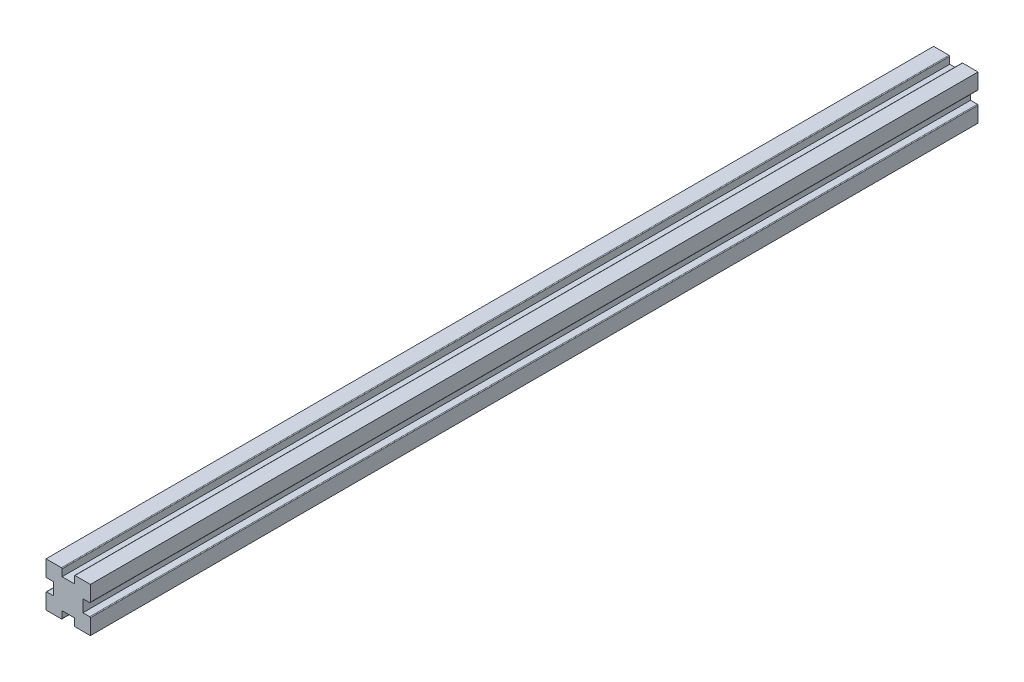
ISO-10303-21;
HEADER;
FILE_DESCRIPTION(('STEP AP214'),'2;1');
FILE_NAME('part.step','',(''),(''),'','','');
FILE_SCHEMA(('AUTOMOTIVE_DESIGN { 1 0 10303 214 1 1 1 1 }'));
ENDSEC;
DATA;
#1=APPLICATION_CONTEXT('core data for automotive mechanical design processes');
#2=APPLICATION_PROTOCOL_DEFINITION('international standard','automotive_design',2000,#1);
#3=PRODUCT_CONTEXT('',#1,'mechanical');
#4=PRODUCT('Part','Part','',(#3));
#5=PRODUCT_RELATED_PRODUCT_CATEGORY('part','',(#4));
#6=PRODUCT_DEFINITION_FORMATION('','',#4);
#7=PRODUCT_DEFINITION_CONTEXT('part definition',#1,'design');
#8=PRODUCT_DEFINITION('design','',#6,#7);
#9=PRODUCT_DEFINITION_SHAPE('','',#8);
#10=(LENGTH_UNIT() NAMED_UNIT(*) SI_UNIT(.MILLI.,.METRE.));
#11=(NAMED_UNIT(*) PLANE_ANGLE_UNIT() SI_UNIT($,.RADIAN.));
#12=(NAMED_UNIT(*) SI_UNIT($,.STERADIAN.) SOLID_ANGLE_UNIT());
#13=UNCERTAINTY_MEASURE_WITH_UNIT(LENGTH_MEASURE(1.E-05),#10,'distance_accuracy_value','');
#14=(GEOMETRIC_REPRESENTATION_CONTEXT(3) GLOBAL_UNCERTAINTY_ASSIGNED_CONTEXT((#13)) GLOBAL_UNIT_ASSIGNED_CONTEXT((#10,
#11,#12)) REPRESENTATION_CONTEXT('',''));
#15=CARTESIAN_POINT('',(0.,0.,0.));
#16=DIRECTION('',(0.,0.,1.));
#17=DIRECTION('',(1.,0.,0.));
#18=AXIS2_PLACEMENT_3D('',#15,#16,#17);
#19=CARTESIAN_POINT('',(-10.108163265306,0.,609.6));
#20=DIRECTION('',(-1.,0.,0.));
#21=DIRECTION('',(0.,-1.,0.));
#22=AXIS2_PLACEMENT_3D('',#19,#20,#21);
#23=PLANE('',#22);
#24=DIRECTION('',(0.,1.,0.));
#25=VECTOR('',#24,1.);
#26=CARTESIAN_POINT('',(-10.108163265306,0.,0.));
#27=LINE('',#26,#25);
#28=CARTESIAN_POINT('',(-10.108163265306,-4.18500000000006,0.));
#29=VERTEX_POINT('',#28);
#30=CARTESIAN_POINT('',(-10.108163265306,4.18499999999994,0.));
#31=VERTEX_POINT('',#30);
#32=EDGE_CURVE('E242',#29,#31,#27,.T.);
#33=ORIENTED_EDGE('',*,*,#32,.F.);
#34=DIRECTION('',(0.,0.,-1.));
#35=VECTOR('',#34,1.);
#36=CARTESIAN_POINT('',(-10.108163265306,-4.18500000000006,609.6));
#37=LINE('',#36,#35);
#38=CARTESIAN_POINT('',(-10.108163265306,-4.18500000000006,609.6));
#39=VERTEX_POINT('',#38);
#40=EDGE_CURVE('E229',#39,#29,#37,.T.);
#41=ORIENTED_EDGE('',*,*,#40,.F.);
#42=DIRECTION('',(0.,1.,0.));
#43=VECTOR('',#42,1.);
#44=CARTESIAN_POINT('',(-10.108163265306,0.,609.6));
#45=LINE('',#44,#43);
#46=CARTESIAN_POINT('',(-10.108163265306,4.18499999999994,609.6));
#47=VERTEX_POINT('',#46);
#48=EDGE_CURVE('E236',#39,#47,#45,.T.);
#49=ORIENTED_EDGE('',*,*,#48,.T.);
#50=DIRECTION('',(0.,0.,-1.));
#51=VECTOR('',#50,1.);
#52=CARTESIAN_POINT('',(-10.108163265306,4.18499999999994,609.6));
#53=LINE('',#52,#51);
#54=EDGE_CURVE('E288',#47,#31,#53,.T.);
#55=ORIENTED_EDGE('',*,*,#54,.T.);
#56=EDGE_LOOP('',(#33,#41,#49,#55));
#57=FACE_BOUND('',#56,.T.);
#58=ADVANCED_FACE('F39',(#57),#23,.T.);
#59=CARTESIAN_POINT('',(0.,-4.18500000000006,609.6));
#60=DIRECTION('',(0.,1.,0.));
#61=DIRECTION('',(0.,0.,1.));
#62=AXIS2_PLACEMENT_3D('',#59,#60,#61);
#63=PLANE('',#62);
#64=DIRECTION('',(1.,0.,0.));
#65=VECTOR('',#64,1.);
#66=CARTESIAN_POINT('',(0.,-4.18500000000006,0.));
#67=LINE('',#66,#65);
#68=CARTESIAN_POINT('',(-14.74,-4.18500000000006,0.));
#69=VERTEX_POINT('',#68);
#70=EDGE_CURVE('E290',#69,#29,#67,.T.);
#71=ORIENTED_EDGE('',*,*,#70,.F.);
#72=DIRECTION('',(0.,0.,-1.));
#73=VECTOR('',#72,1.);
#74=CARTESIAN_POINT('',(-14.74,-4.18500000000006,609.6));
#75=LINE('',#74,#73);
#76=CARTESIAN_POINT('',(-14.74,-4.18500000000006,609.6));
#77=VERTEX_POINT('',#76);
#78=EDGE_CURVE('E232',#69,#77,#75,.F.);
#79=ORIENTED_EDGE('',*,*,#78,.T.);
#80=DIRECTION('',(1.,0.,0.));
#81=VECTOR('',#80,1.);
#82=CARTESIAN_POINT('',(0.,-4.18500000000006,609.6));
#83=LINE('',#82,#81);
#84=EDGE_CURVE('E225',#77,#39,#83,.T.);
#85=ORIENTED_EDGE('',*,*,#84,.T.);
#86=ORIENTED_EDGE('',*,*,#40,.T.);
#87=EDGE_LOOP('',(#71,#79,#85,#86));
#88=FACE_BOUND('',#87,.T.);
#89=ADVANCED_FACE('F228',(#88),#63,.T.);
#90=CARTESIAN_POINT('',(-15.24,0.,609.6));
#91=DIRECTION('',(1.,0.,0.));
#92=DIRECTION('',(0.,0.,-1.));
#93=AXIS2_PLACEMENT_3D('',#90,#91,#92);
#94=PLANE('',#93);
#95=DIRECTION('',(0.,-1.,0.));
#96=VECTOR('',#95,1.);
#97=CARTESIAN_POINT('',(-15.24,0.,609.6));
#98=LINE('',#97,#96);
#99=CARTESIAN_POINT('',(-15.24,-4.68500000000006,609.6));
#100=VERTEX_POINT('',#99);
#101=CARTESIAN_POINT('',(-15.24,-15.24,609.6));
#102=VERTEX_POINT('',#101);
#103=EDGE_CURVE('E235',#100,#102,#98,.T.);
#104=ORIENTED_EDGE('',*,*,#103,.F.);
#105=DIRECTION('',(0.,0.,-1.));
#106=VECTOR('',#105,1.);
#107=CARTESIAN_POINT('',(-15.24,-4.68500000000006,0.));
#108=LINE('',#107,#106);
#109=CARTESIAN_POINT('',(-15.24,-4.68500000000006,0.));
#110=VERTEX_POINT('',#109);
#111=EDGE_CURVE('E395',#100,#110,#108,.T.);
#112=ORIENTED_EDGE('',*,*,#111,.T.);
#113=DIRECTION('',(0.,-1.,0.));
#114=VECTOR('',#113,1.);
#115=CARTESIAN_POINT('',(-15.24,0.,0.));
#116=LINE('',#115,#114);
#117=CARTESIAN_POINT('',(-15.24,-15.24,0.));
#118=VERTEX_POINT('',#117);
#119=EDGE_CURVE('E292',#110,#118,#116,.T.);
#120=ORIENTED_EDGE('',*,*,#119,.T.);
#121=DIRECTION('',(0.,0.,-1.));
#122=VECTOR('',#121,1.);
#123=CARTESIAN_POINT('',(-15.24,-15.24,609.6));
#124=LINE('',#123,#122);
#125=EDGE_CURVE('E244',#102,#118,#124,.T.);
#126=ORIENTED_EDGE('',*,*,#125,.F.);
#127=EDGE_LOOP('',(#104,#112,#120,#126));
#128=FACE_BOUND('',#127,.T.);
#129=ADVANCED_FACE('F512',(#128),#94,.F.);
#130=CARTESIAN_POINT('',(0.,-15.24,609.6));
#131=DIRECTION('',(0.,1.,0.));
#132=DIRECTION('',(0.,0.,1.));
#133=AXIS2_PLACEMENT_3D('',#130,#131,#132);
#134=PLANE('',#133);
#135=DIRECTION('',(1.,0.,0.));
#136=VECTOR('',#135,1.);
#137=CARTESIAN_POINT('',(0.,-15.24,0.));
#138=LINE('',#137,#136);
#139=CARTESIAN_POINT('',(-4.68499999999978,-15.24,0.));
#140=VERTEX_POINT('',#139);
#141=EDGE_CURVE('E294',#118,#140,#138,.T.);
#142=ORIENTED_EDGE('',*,*,#141,.T.);
#143=DIRECTION('',(0.,0.,-1.));
#144=VECTOR('',#143,1.);
#145=CARTESIAN_POINT('',(-4.68499999999978,-15.24,609.6));
#146=LINE('',#145,#144);
#147=CARTESIAN_POINT('',(-4.68499999999978,-15.24,609.6));
#148=VERTEX_POINT('',#147);
#149=EDGE_CURVE('E373',#140,#148,#146,.F.);
#150=ORIENTED_EDGE('',*,*,#149,.T.);
#151=DIRECTION('',(1.,0.,0.));
#152=VECTOR('',#151,1.);
#153=CARTESIAN_POINT('',(0.,-15.24,609.6));
#154=LINE('',#153,#152);
#155=EDGE_CURVE('E256',#102,#148,#154,.T.);
#156=ORIENTED_EDGE('',*,*,#155,.F.);
#157=ORIENTED_EDGE('',*,*,#125,.T.);
#158=EDGE_LOOP('',(#142,#150,#156,#157));
#159=FACE_BOUND('',#158,.T.);
#160=ADVANCED_FACE('F519',(#159),#134,.F.);
#161=CARTESIAN_POINT('',(-4.18499999999979,0.,609.6));
#162=DIRECTION('',(-1.,0.,0.));
#163=DIRECTION('',(0.,-1.,0.));
#164=AXIS2_PLACEMENT_3D('',#161,#162,#163);
#165=PLANE('',#164);
#166=DIRECTION('',(0.,1.,0.));
#167=VECTOR('',#166,1.);
#168=CARTESIAN_POINT('',(-4.18499999999979,0.,609.6));
#169=LINE('',#168,#167);
#170=CARTESIAN_POINT('',(-4.18499999999978,-14.74,609.6));
#171=VERTEX_POINT('',#170);
#172=CARTESIAN_POINT('',(-4.18499999999978,-10.108163265306,609.6));
#173=VERTEX_POINT('',#172);
#174=EDGE_CURVE('E259',#171,#173,#169,.T.);
#175=ORIENTED_EDGE('',*,*,#174,.F.);
#176=DIRECTION('',(0.,0.,-1.));
#177=VECTOR('',#176,1.);
#178=CARTESIAN_POINT('',(-4.18499999999978,-14.74,609.6));
#179=LINE('',#178,#177);
#180=CARTESIAN_POINT('',(-4.18499999999978,-14.74,0.));
#181=VERTEX_POINT('',#180);
#182=EDGE_CURVE('E243',#171,#181,#179,.T.);
#183=ORIENTED_EDGE('',*,*,#182,.T.);
#184=DIRECTION('',(0.,1.,0.));
#185=VECTOR('',#184,1.);
#186=CARTESIAN_POINT('',(-4.18499999999979,0.,0.));
#187=LINE('',#186,#185);
#188=CARTESIAN_POINT('',(-4.18499999999978,-10.108163265306,0.));
#189=VERTEX_POINT('',#188);
#190=EDGE_CURVE('E297',#181,#189,#187,.T.);
#191=ORIENTED_EDGE('',*,*,#190,.T.);
#192=DIRECTION('',(0.,0.,-1.));
#193=VECTOR('',#192,1.);
#194=CARTESIAN_POINT('',(-4.18499999999978,-10.108163265306,609.6));
#195=LINE('',#194,#193);
#196=EDGE_CURVE('E350',#173,#189,#195,.T.);
#197=ORIENTED_EDGE('',*,*,#196,.F.);
#198=EDGE_LOOP('',(#175,#183,#191,#197));
#199=FACE_BOUND('',#198,.T.);
#200=ADVANCED_FACE('F515',(#199),#165,.F.);
#201=CARTESIAN_POINT('',(0.,-10.108163265306,609.6));
#202=DIRECTION('',(0.,-1.,0.));
#203=DIRECTION('',(1.,0.,0.));
#204=AXIS2_PLACEMENT_3D('',#201,#202,#203);
#205=PLANE('',#204);
#206=DIRECTION('',(-1.,0.,0.));
#207=VECTOR('',#206,1.);
#208=CARTESIAN_POINT('',(0.,-10.108163265306,0.));
#209=LINE('',#208,#207);
#210=CARTESIAN_POINT('',(4.18500000000022,-10.108163265306,0.));
#211=VERTEX_POINT('',#210);
#212=EDGE_CURVE('E300',#211,#189,#209,.T.);
#213=ORIENTED_EDGE('',*,*,#212,.F.);
#214=DIRECTION('',(0.,0.,-1.));
#215=VECTOR('',#214,1.);
#216=CARTESIAN_POINT('',(4.18500000000022,-10.108163265306,609.6));
#217=LINE('',#216,#215);
#218=CARTESIAN_POINT('',(4.18500000000022,-10.108163265306,609.6));
#219=VERTEX_POINT('',#218);
#220=EDGE_CURVE('E347',#219,#211,#217,.T.);
#221=ORIENTED_EDGE('',*,*,#220,.F.);
#222=DIRECTION('',(-1.,0.,0.));
#223=VECTOR('',#222,1.);
#224=CARTESIAN_POINT('',(0.,-10.108163265306,609.6));
#225=LINE('',#224,#223);
#226=EDGE_CURVE('E262',#219,#173,#225,.T.);
#227=ORIENTED_EDGE('',*,*,#226,.T.);
#228=ORIENTED_EDGE('',*,*,#196,.T.);
#229=EDGE_LOOP('',(#213,#221,#227,#228));
#230=FACE_BOUND('',#229,.T.);
#231=ADVANCED_FACE('F518',(#230),#205,.T.);
#232=CARTESIAN_POINT('',(4.18500000000022,0.,609.6));
#233=DIRECTION('',(-1.,0.,0.));
#234=DIRECTION('',(0.,0.,1.));
#235=AXIS2_PLACEMENT_3D('',#232,#233,#234);
#236=PLANE('',#235);
#237=DIRECTION('',(0.,1.,0.));
#238=VECTOR('',#237,1.);
#239=CARTESIAN_POINT('',(4.18500000000022,0.,0.));
#240=LINE('',#239,#238);
#241=CARTESIAN_POINT('',(4.18500000000022,-14.74,0.));
#242=VERTEX_POINT('',#241);
#243=EDGE_CURVE('E303',#242,#211,#240,.T.);
#244=ORIENTED_EDGE('',*,*,#243,.F.);
#245=DIRECTION('',(0.,0.,-1.));
#246=VECTOR('',#245,1.);
#247=CARTESIAN_POINT('',(4.18500000000022,-14.74,609.6));
#248=LINE('',#247,#246);
#249=CARTESIAN_POINT('',(4.18500000000022,-14.74,609.6));
#250=VERTEX_POINT('',#249);
#251=EDGE_CURVE('E393',#242,#250,#248,.F.);
#252=ORIENTED_EDGE('',*,*,#251,.T.);
#253=DIRECTION('',(0.,1.,0.));
#254=VECTOR('',#253,1.);
#255=CARTESIAN_POINT('',(4.18500000000022,0.,609.6));
#256=LINE('',#255,#254);
#257=EDGE_CURVE('E265',#250,#219,#256,.T.);
#258=ORIENTED_EDGE('',*,*,#257,.T.);
#259=ORIENTED_EDGE('',*,*,#220,.T.);
#260=EDGE_LOOP('',(#244,#252,#258,#259));
#261=FACE_BOUND('',#260,.T.);
#262=ADVANCED_FACE('F490',(#261),#236,.T.);
#263=CARTESIAN_POINT('',(4.68500000000022,-15.24,609.6));
#264=VERTEX_POINT('',#263);
#265=CARTESIAN_POINT('',(15.24,-15.24,609.6));
#266=VERTEX_POINT('',#265);
#267=EDGE_CURVE('E260',#264,#266,#154,.T.);
#268=ORIENTED_EDGE('',*,*,#267,.F.);
#269=DIRECTION('',(0.,0.,-1.));
#270=VECTOR('',#269,1.);
#271=CARTESIAN_POINT('',(4.68500000000022,-15.24,0.));
#272=LINE('',#271,#270);
#273=CARTESIAN_POINT('',(4.68500000000022,-15.24,0.));
#274=VERTEX_POINT('',#273);
#275=EDGE_CURVE('E390',#264,#274,#272,.T.);
#276=ORIENTED_EDGE('',*,*,#275,.T.);
#277=CARTESIAN_POINT('',(15.24,-15.24,0.));
#278=VERTEX_POINT('',#277);
#279=EDGE_CURVE('E298',#274,#278,#138,.T.);
#280=ORIENTED_EDGE('',*,*,#279,.T.);
#281=DIRECTION('',(0.,0.,-1.));
#282=VECTOR('',#281,1.);
#283=CARTESIAN_POINT('',(15.24,-15.24,609.6));
#284=LINE('',#283,#282);
#285=EDGE_CURVE('E344',#266,#278,#284,.T.);
#286=ORIENTED_EDGE('',*,*,#285,.F.);
#287=EDGE_LOOP('',(#268,#276,#280,#286));
#288=FACE_BOUND('',#287,.T.);
#289=ADVANCED_FACE('F484',(#288),#134,.F.);
#290=CARTESIAN_POINT('',(15.24,0.,609.6));
#291=DIRECTION('',(1.,0.,0.));
#292=DIRECTION('',(0.,0.,-1.));
#293=AXIS2_PLACEMENT_3D('',#290,#291,#292);
#294=PLANE('',#293);
#295=DIRECTION('',(0.,-1.,0.));
#296=VECTOR('',#295,1.);
#297=CARTESIAN_POINT('',(15.24,0.,0.));
#298=LINE('',#297,#296);
#299=CARTESIAN_POINT('',(15.24,-4.68499999999984,0.));
#300=VERTEX_POINT('',#299);
#301=EDGE_CURVE('E305',#300,#278,#298,.T.);
#302=ORIENTED_EDGE('',*,*,#301,.F.);
#303=DIRECTION('',(0.,0.,-1.));
#304=VECTOR('',#303,1.);
#305=CARTESIAN_POINT('',(15.24,-4.68499999999984,609.6));
#306=LINE('',#305,#304);
#307=CARTESIAN_POINT('',(15.24,-4.68499999999984,609.6));
#308=VERTEX_POINT('',#307);
#309=EDGE_CURVE('E411',#300,#308,#306,.F.);
#310=ORIENTED_EDGE('',*,*,#309,.T.);
#311=DIRECTION('',(0.,-1.,0.));
#312=VECTOR('',#311,1.);
#313=CARTESIAN_POINT('',(15.24,0.,609.6));
#314=LINE('',#313,#312);
#315=EDGE_CURVE('E267',#308,#266,#314,.T.);
#316=ORIENTED_EDGE('',*,*,#315,.T.);
#317=ORIENTED_EDGE('',*,*,#285,.T.);
#318=EDGE_LOOP('',(#302,#310,#316,#317));
#319=FACE_BOUND('',#318,.T.);
#320=ADVANCED_FACE('F476',(#319),#294,.T.);
#321=CARTESIAN_POINT('',(0.,-4.18499999999985,609.6));
#322=DIRECTION('',(0.,-1.,0.));
#323=DIRECTION('',(1.,0.,0.));
#324=AXIS2_PLACEMENT_3D('',#321,#322,#323);
#325=PLANE('',#324);
#326=DIRECTION('',(-1.,0.,0.));
#327=VECTOR('',#326,1.);
#328=CARTESIAN_POINT('',(0.,-4.18499999999985,609.6));
#329=LINE('',#328,#327);
#330=CARTESIAN_POINT('',(14.74,-4.18499999999984,609.6));
#331=VERTEX_POINT('',#330);
#332=CARTESIAN_POINT('',(10.1081632653062,-4.18499999999984,609.6));
#333=VERTEX_POINT('',#332);
#334=EDGE_CURVE('E269',#331,#333,#329,.T.);
#335=ORIENTED_EDGE('',*,*,#334,.F.);
#336=DIRECTION('',(0.,0.,-1.));
#337=VECTOR('',#336,1.);
#338=CARTESIAN_POINT('',(14.74,-4.18499999999984,0.));
#339=LINE('',#338,#337);
#340=CARTESIAN_POINT('',(14.74,-4.18499999999984,0.));
#341=VERTEX_POINT('',#340);
#342=EDGE_CURVE('E408',#331,#341,#339,.T.);
#343=ORIENTED_EDGE('',*,*,#342,.T.);
#344=DIRECTION('',(-1.,0.,0.));
#345=VECTOR('',#344,1.);
#346=CARTESIAN_POINT('',(0.,-4.18499999999985,0.));
#347=LINE('',#346,#345);
#348=CARTESIAN_POINT('',(10.1081632653062,-4.18499999999984,0.));
#349=VERTEX_POINT('',#348);
#350=EDGE_CURVE('E308',#341,#349,#347,.T.);
#351=ORIENTED_EDGE('',*,*,#350,.T.);
#352=DIRECTION('',(0.,0.,-1.));
#353=VECTOR('',#352,1.);
#354=CARTESIAN_POINT('',(10.1081632653062,-4.18499999999984,609.6));
#355=LINE('',#354,#353);
#356=EDGE_CURVE('E341',#333,#349,#355,.T.);
#357=ORIENTED_EDGE('',*,*,#356,.F.);
#358=EDGE_LOOP('',(#335,#343,#351,#357));
#359=FACE_BOUND('',#358,.T.);
#360=ADVANCED_FACE('F468',(#359),#325,.F.);
#361=CARTESIAN_POINT('',(10.1081632653062,0.,609.6));
#362=DIRECTION('',(1.,0.,0.));
#363=DIRECTION('',(0.,1.,0.));
#364=AXIS2_PLACEMENT_3D('',#361,#362,#363);
#365=PLANE('',#364);
#366=DIRECTION('',(0.,-1.,0.));
#367=VECTOR('',#366,1.);
#368=CARTESIAN_POINT('',(10.1081632653062,0.,0.));
#369=LINE('',#368,#367);
#370=CARTESIAN_POINT('',(10.1081632653062,4.18500000000016,0.));
#371=VERTEX_POINT('',#370);
#372=EDGE_CURVE('E311',#371,#349,#369,.T.);
#373=ORIENTED_EDGE('',*,*,#372,.F.);
#374=DIRECTION('',(0.,0.,-1.));
#375=VECTOR('',#374,1.);
#376=CARTESIAN_POINT('',(10.1081632653062,4.18500000000016,609.6));
#377=LINE('',#376,#375);
#378=CARTESIAN_POINT('',(10.1081632653062,4.18500000000016,609.6));
#379=VERTEX_POINT('',#378);
#380=EDGE_CURVE('E338',#379,#371,#377,.T.);
#381=ORIENTED_EDGE('',*,*,#380,.F.);
#382=DIRECTION('',(0.,-1.,0.));
#383=VECTOR('',#382,1.);
#384=CARTESIAN_POINT('',(10.1081632653062,0.,609.6));
#385=LINE('',#384,#383);
#386=EDGE_CURVE('E272',#379,#333,#385,.T.);
#387=ORIENTED_EDGE('',*,*,#386,.T.);
#388=ORIENTED_EDGE('',*,*,#356,.T.);
#389=EDGE_LOOP('',(#373,#381,#387,#388));
#390=FACE_BOUND('',#389,.T.);
#391=ADVANCED_FACE('F464',(#390),#365,.T.);
#392=CARTESIAN_POINT('',(0.,4.18500000000016,609.6));
#393=DIRECTION('',(0.,-1.,0.));
#394=DIRECTION('',(0.,0.,-1.));
#395=AXIS2_PLACEMENT_3D('',#392,#393,#394);
#396=PLANE('',#395);
#397=DIRECTION('',(-1.,0.,0.));
#398=VECTOR('',#397,1.);
#399=CARTESIAN_POINT('',(0.,4.18500000000016,0.));
#400=LINE('',#399,#398);
#401=CARTESIAN_POINT('',(14.74,4.18500000000016,0.));
#402=VERTEX_POINT('',#401);
#403=EDGE_CURVE('E314',#402,#371,#400,.T.);
#404=ORIENTED_EDGE('',*,*,#403,.F.);
#405=DIRECTION('',(0.,0.,-1.));
#406=VECTOR('',#405,1.);
#407=CARTESIAN_POINT('',(14.74,4.18500000000016,609.6));
#408=LINE('',#407,#406);
#409=CARTESIAN_POINT('',(14.74,4.18500000000016,609.6));
#410=VERTEX_POINT('',#409);
#411=EDGE_CURVE('E406',#402,#410,#408,.F.);
#412=ORIENTED_EDGE('',*,*,#411,.T.);
#413=DIRECTION('',(-1.,0.,0.));
#414=VECTOR('',#413,1.);
#415=CARTESIAN_POINT('',(0.,4.18500000000016,609.6));
#416=LINE('',#415,#414);
#417=EDGE_CURVE('E275',#410,#379,#416,.T.);
#418=ORIENTED_EDGE('',*,*,#417,.T.);
#419=ORIENTED_EDGE('',*,*,#380,.T.);
#420=EDGE_LOOP('',(#404,#412,#418,#419));
#421=FACE_BOUND('',#420,.T.);
#422=ADVANCED_FACE('F457',(#421),#396,.T.);
#423=CARTESIAN_POINT('',(15.24,15.24,609.6));
#424=VERTEX_POINT('',#423);
#425=CARTESIAN_POINT('',(15.24,4.68500000000015,609.6));
#426=VERTEX_POINT('',#425);
#427=EDGE_CURVE('E270',#424,#426,#314,.T.);
#428=ORIENTED_EDGE('',*,*,#427,.T.);
#429=DIRECTION('',(0.,0.,-1.));
#430=VECTOR('',#429,1.);
#431=CARTESIAN_POINT('',(15.24,4.68500000000015,609.6));
#432=LINE('',#431,#430);
#433=CARTESIAN_POINT('',(15.24,4.68500000000015,0.));
#434=VERTEX_POINT('',#433);
#435=EDGE_CURVE('E403',#426,#434,#432,.T.);
#436=ORIENTED_EDGE('',*,*,#435,.T.);
#437=CARTESIAN_POINT('',(15.24,15.24,0.));
#438=VERTEX_POINT('',#437);
#439=EDGE_CURVE('E309',#438,#434,#298,.T.);
#440=ORIENTED_EDGE('',*,*,#439,.F.);
#441=DIRECTION('',(0.,0.,-1.));
#442=VECTOR('',#441,1.);
#443=CARTESIAN_POINT('',(15.24,15.24,609.6));
#444=LINE('',#443,#442);
#445=EDGE_CURVE('E335',#424,#438,#444,.T.);
#446=ORIENTED_EDGE('',*,*,#445,.F.);
#447=EDGE_LOOP('',(#428,#436,#440,#446));
#448=FACE_BOUND('',#447,.T.);
#449=ADVANCED_FACE('F449',(#448),#294,.T.);
#450=CARTESIAN_POINT('',(0.,15.24,609.6));
#451=DIRECTION('',(0.,1.,0.));
#452=DIRECTION('',(0.,0.,1.));
#453=AXIS2_PLACEMENT_3D('',#450,#451,#452);
#454=PLANE('',#453);
#455=DIRECTION('',(1.,0.,0.));
#456=VECTOR('',#455,1.);
#457=CARTESIAN_POINT('',(0.,15.24,0.));
#458=LINE('',#457,#456);
#459=CARTESIAN_POINT('',(4.685,15.24,0.));
#460=VERTEX_POINT('',#459);
#461=EDGE_CURVE('E316',#460,#438,#458,.T.);
#462=ORIENTED_EDGE('',*,*,#461,.F.);
#463=DIRECTION('',(0.,0.,-1.));
#464=VECTOR('',#463,1.);
#465=CARTESIAN_POINT('',(4.685,15.24,609.6));
#466=LINE('',#465,#464);
#467=CARTESIAN_POINT('',(4.685,15.24,609.6));
#468=VERTEX_POINT('',#467);
#469=EDGE_CURVE('E11',#460,#468,#466,.F.);
#470=ORIENTED_EDGE('',*,*,#469,.T.);
#471=DIRECTION('',(1.,0.,0.));
#472=VECTOR('',#471,1.);
#473=CARTESIAN_POINT('',(0.,15.24,609.6));
#474=LINE('',#473,#472);
#475=EDGE_CURVE('E277',#468,#424,#474,.T.);
#476=ORIENTED_EDGE('',*,*,#475,.T.);
#477=ORIENTED_EDGE('',*,*,#445,.T.);
#478=EDGE_LOOP('',(#462,#470,#476,#477));
#479=FACE_BOUND('',#478,.T.);
#480=ADVANCED_FACE('F442',(#479),#454,.T.);
#481=CARTESIAN_POINT('',(4.185,0.,609.6));
#482=DIRECTION('',(1.,0.,0.));
#483=DIRECTION('',(0.,1.,0.));
#484=AXIS2_PLACEMENT_3D('',#481,#482,#483);
#485=PLANE('',#484);
#486=DIRECTION('',(0.,-1.,0.));
#487=VECTOR('',#486,1.);
#488=CARTESIAN_POINT('',(4.185,0.,609.6));
#489=LINE('',#488,#487);
#490=CARTESIAN_POINT('',(4.185,14.74,609.6));
#491=VERTEX_POINT('',#490);
#492=CARTESIAN_POINT('',(4.185,10.1081632653061,609.6));
#493=VERTEX_POINT('',#492);
#494=EDGE_CURVE('E279',#491,#493,#489,.T.);
#495=ORIENTED_EDGE('',*,*,#494,.F.);
#496=DIRECTION('',(0.,0.,-1.));
#497=VECTOR('',#496,1.);
#498=CARTESIAN_POINT('',(4.185,14.74,0.));
#499=LINE('',#498,#497);
#500=CARTESIAN_POINT('',(4.185,14.74,0.));
#501=VERTEX_POINT('',#500);
#502=EDGE_CURVE('E47',#491,#501,#499,.T.);
#503=ORIENTED_EDGE('',*,*,#502,.T.);
#504=DIRECTION('',(0.,-1.,0.));
#505=VECTOR('',#504,1.);
#506=CARTESIAN_POINT('',(4.185,0.,0.));
#507=LINE('',#506,#505);
#508=CARTESIAN_POINT('',(4.185,10.1081632653061,0.));
#509=VERTEX_POINT('',#508);
#510=EDGE_CURVE('E318',#501,#509,#507,.T.);
#511=ORIENTED_EDGE('',*,*,#510,.T.);
#512=DIRECTION('',(0.,0.,-1.));
#513=VECTOR('',#512,1.);
#514=CARTESIAN_POINT('',(4.185,10.1081632653061,609.6));
#515=LINE('',#514,#513);
#516=EDGE_CURVE('E332',#493,#509,#515,.T.);
#517=ORIENTED_EDGE('',*,*,#516,.F.);
#518=EDGE_LOOP('',(#495,#503,#511,#517));
#519=FACE_BOUND('',#518,.T.);
#520=ADVANCED_FACE('F422',(#519),#485,.F.);
#521=CARTESIAN_POINT('',(0.,10.1081632653061,609.6));
#522=DIRECTION('',(0.,1.,0.));
#523=DIRECTION('',(-1.,0.,0.));
#524=AXIS2_PLACEMENT_3D('',#521,#522,#523);
#525=PLANE('',#524);
#526=DIRECTION('',(1.,0.,0.));
#527=VECTOR('',#526,1.);
#528=CARTESIAN_POINT('',(0.,10.1081632653061,0.));
#529=LINE('',#528,#527);
#530=CARTESIAN_POINT('',(-4.185,10.1081632653061,0.));
#531=VERTEX_POINT('',#530);
#532=EDGE_CURVE('E321',#531,#509,#529,.T.);
#533=ORIENTED_EDGE('',*,*,#532,.F.);
#534=DIRECTION('',(0.,0.,-1.));
#535=VECTOR('',#534,1.);
#536=CARTESIAN_POINT('',(-4.185,10.1081632653061,609.6));
#537=LINE('',#536,#535);
#538=CARTESIAN_POINT('',(-4.185,10.1081632653061,609.6));
#539=VERTEX_POINT('',#538);
#540=EDGE_CURVE('E329',#539,#531,#537,.T.);
#541=ORIENTED_EDGE('',*,*,#540,.F.);
#542=DIRECTION('',(1.,0.,0.));
#543=VECTOR('',#542,1.);
#544=CARTESIAN_POINT('',(0.,10.1081632653061,609.6));
#545=LINE('',#544,#543);
#546=EDGE_CURVE('E282',#539,#493,#545,.T.);
#547=ORIENTED_EDGE('',*,*,#546,.T.);
#548=ORIENTED_EDGE('',*,*,#516,.T.);
#549=EDGE_LOOP('',(#533,#541,#547,#548));
#550=FACE_BOUND('',#549,.T.);
#551=ADVANCED_FACE('F434',(#550),#525,.T.);
#552=CARTESIAN_POINT('',(-4.185,0.,609.6));
#553=DIRECTION('',(1.,0.,0.));
#554=DIRECTION('',(0.,1.,0.));
#555=AXIS2_PLACEMENT_3D('',#552,#553,#554);
#556=PLANE('',#555);
#557=DIRECTION('',(0.,-1.,0.));
#558=VECTOR('',#557,1.);
#559=CARTESIAN_POINT('',(-4.185,0.,0.));
#560=LINE('',#559,#558);
#561=CARTESIAN_POINT('',(-4.185,14.74,0.));
#562=VERTEX_POINT('',#561);
#563=EDGE_CURVE('E324',#562,#531,#560,.T.);
#564=ORIENTED_EDGE('',*,*,#563,.F.);
#565=DIRECTION('',(0.,0.,-1.));
#566=VECTOR('',#565,1.);
#567=CARTESIAN_POINT('',(-4.185,14.74,609.6));
#568=LINE('',#567,#566);
#569=CARTESIAN_POINT('',(-4.185,14.74,609.6));
#570=VERTEX_POINT('',#569);
#571=EDGE_CURVE('E416',#562,#570,#568,.F.);
#572=ORIENTED_EDGE('',*,*,#571,.T.);
#573=DIRECTION('',(0.,-1.,0.));
#574=VECTOR('',#573,1.);
#575=CARTESIAN_POINT('',(-4.185,0.,609.6));
#576=LINE('',#575,#574);
#577=EDGE_CURVE('E285',#570,#539,#576,.T.);
#578=ORIENTED_EDGE('',*,*,#577,.T.);
#579=ORIENTED_EDGE('',*,*,#540,.T.);
#580=EDGE_LOOP('',(#564,#572,#578,#579));
#581=FACE_BOUND('',#580,.T.);
#582=ADVANCED_FACE('F540',(#581),#556,.T.);
#583=CARTESIAN_POINT('',(-15.24,15.24,609.6));
#584=VERTEX_POINT('',#583);
#585=CARTESIAN_POINT('',(-4.685,15.24,609.6));
#586=VERTEX_POINT('',#585);
#587=EDGE_CURVE('E280',#584,#586,#474,.T.);
#588=ORIENTED_EDGE('',*,*,#587,.T.);
#589=DIRECTION('',(0.,0.,-1.));
#590=VECTOR('',#589,1.);
#591=CARTESIAN_POINT('',(-4.685,15.24,609.6));
#592=LINE('',#591,#590);
#593=CARTESIAN_POINT('',(-4.685,15.24,0.));
#594=VERTEX_POINT('',#593);
#595=EDGE_CURVE('E413',#586,#594,#592,.T.);
#596=ORIENTED_EDGE('',*,*,#595,.T.);
#597=CARTESIAN_POINT('',(-15.24,15.24,0.));
#598=VERTEX_POINT('',#597);
#599=EDGE_CURVE('E319',#598,#594,#458,.T.);
#600=ORIENTED_EDGE('',*,*,#599,.F.);
#601=DIRECTION('',(0.,0.,-1.));
#602=VECTOR('',#601,1.);
#603=CARTESIAN_POINT('',(-15.24,15.24,609.6));
#604=LINE('',#603,#602);
#605=EDGE_CURVE('E327',#584,#598,#604,.T.);
#606=ORIENTED_EDGE('',*,*,#605,.F.);
#607=EDGE_LOOP('',(#588,#596,#600,#606));
#608=FACE_BOUND('',#607,.T.);
#609=ADVANCED_FACE('F543',(#608),#454,.T.);
#610=CARTESIAN_POINT('',(-15.24,4.68499999999993,0.));
#611=VERTEX_POINT('',#610);
#612=EDGE_CURVE('E252',#598,#611,#116,.T.);
#613=ORIENTED_EDGE('',*,*,#612,.T.);
#614=DIRECTION('',(0.,0.,-1.));
#615=VECTOR('',#614,1.);
#616=CARTESIAN_POINT('',(-15.24,4.68499999999993,609.6));
#617=LINE('',#616,#615);
#618=CARTESIAN_POINT('',(-15.24,4.68499999999993,609.6));
#619=VERTEX_POINT('',#618);
#620=EDGE_CURVE('E62',#611,#619,#617,.F.);
#621=ORIENTED_EDGE('',*,*,#620,.T.);
#622=EDGE_CURVE('E257',#584,#619,#98,.T.);
#623=ORIENTED_EDGE('',*,*,#622,.F.);
#624=ORIENTED_EDGE('',*,*,#605,.T.);
#625=EDGE_LOOP('',(#613,#621,#623,#624));
#626=FACE_BOUND('',#625,.T.);
#627=ADVANCED_FACE('F547',(#626),#94,.F.);
#628=CARTESIAN_POINT('',(0.,4.18499999999994,609.6));
#629=DIRECTION('',(0.,1.,0.));
#630=DIRECTION('',(-1.,0.,0.));
#631=AXIS2_PLACEMENT_3D('',#628,#629,#630);
#632=PLANE('',#631);
#633=DIRECTION('',(1.,0.,0.));
#634=VECTOR('',#633,1.);
#635=CARTESIAN_POINT('',(0.,4.18499999999994,609.6));
#636=LINE('',#635,#634);
#637=CARTESIAN_POINT('',(-14.74,4.18499999999993,609.6));
#638=VERTEX_POINT('',#637);
#639=EDGE_CURVE('E248',#638,#47,#636,.T.);
#640=ORIENTED_EDGE('',*,*,#639,.F.);
#641=DIRECTION('',(0.,0.,-1.));
#642=VECTOR('',#641,1.);
#643=CARTESIAN_POINT('',(-14.74,4.18499999999993,609.6));
#644=LINE('',#643,#642);
#645=CARTESIAN_POINT('',(-14.74,4.18499999999993,0.));
#646=VERTEX_POINT('',#645);
#647=EDGE_CURVE('E399',#638,#646,#644,.T.);
#648=ORIENTED_EDGE('',*,*,#647,.T.);
#649=DIRECTION('',(1.,0.,0.));
#650=VECTOR('',#649,1.);
#651=CARTESIAN_POINT('',(0.,4.18499999999994,0.));
#652=LINE('',#651,#650);
#653=EDGE_CURVE('E250',#646,#31,#652,.T.);
#654=ORIENTED_EDGE('',*,*,#653,.T.);
#655=ORIENTED_EDGE('',*,*,#54,.F.);
#656=EDGE_LOOP('',(#640,#648,#654,#655));
#657=FACE_BOUND('',#656,.T.);
#658=ADVANCED_FACE('F551',(#657),#632,.F.);
#659=CARTESIAN_POINT('',(0.,0.,609.6));
#660=DIRECTION('',(0.,0.,1.));
#661=DIRECTION('',(1.,0.,0.));
#662=AXIS2_PLACEMENT_3D('',#659,#660,#661);
#663=PLANE('',#662);
#664=ORIENTED_EDGE('',*,*,#155,.T.);
#665=CARTESIAN_POINT('',(-4.68499999999978,-14.74,609.6));
#666=DIRECTION('',(0.,0.,1.));
#667=DIRECTION('',(1.,0.,0.));
#668=AXIS2_PLACEMENT_3D('',#665,#666,#667);
#669=CIRCLE('',#668,0.5);
#670=EDGE_CURVE('E388',#148,#171,#669,.T.);
#671=ORIENTED_EDGE('',*,*,#670,.T.);
#672=ORIENTED_EDGE('',*,*,#174,.T.);
#673=ORIENTED_EDGE('',*,*,#226,.F.);
#674=ORIENTED_EDGE('',*,*,#257,.F.);
#675=CARTESIAN_POINT('',(4.68500000000022,-14.74,609.6));
#676=DIRECTION('',(0.,0.,1.));
#677=DIRECTION('',(1.,0.,0.));
#678=AXIS2_PLACEMENT_3D('',#675,#676,#677);
#679=CIRCLE('',#678,0.5);
#680=EDGE_CURVE('E386',#250,#264,#679,.T.);
#681=ORIENTED_EDGE('',*,*,#680,.T.);
#682=ORIENTED_EDGE('',*,*,#267,.T.);
#683=ORIENTED_EDGE('',*,*,#315,.F.);
#684=CARTESIAN_POINT('',(14.74,-4.68499999999984,609.6));
#685=DIRECTION('',(0.,0.,1.));
#686=DIRECTION('',(1.,0.,0.));
#687=AXIS2_PLACEMENT_3D('',#684,#685,#686);
#688=CIRCLE('',#687,0.5);
#689=EDGE_CURVE('E379',#308,#331,#688,.T.);
#690=ORIENTED_EDGE('',*,*,#689,.T.);
#691=ORIENTED_EDGE('',*,*,#334,.T.);
#692=ORIENTED_EDGE('',*,*,#386,.F.);
#693=ORIENTED_EDGE('',*,*,#417,.F.);
#694=CARTESIAN_POINT('',(14.74,4.68500000000015,609.6));
#695=DIRECTION('',(0.,0.,1.));
#696=DIRECTION('',(1.,0.,0.));
#697=AXIS2_PLACEMENT_3D('',#694,#695,#696);
#698=CIRCLE('',#697,0.5);
#699=EDGE_CURVE('E381',#410,#426,#698,.T.);
#700=ORIENTED_EDGE('',*,*,#699,.T.);
#701=ORIENTED_EDGE('',*,*,#427,.F.);
#702=ORIENTED_EDGE('',*,*,#475,.F.);
#703=CARTESIAN_POINT('',(4.685,14.74,609.6));
#704=DIRECTION('',(0.,0.,1.));
#705=DIRECTION('',(1.,0.,0.));
#706=AXIS2_PLACEMENT_3D('',#703,#704,#705);
#707=CIRCLE('',#706,0.5);
#708=EDGE_CURVE('E375',#468,#491,#707,.T.);
#709=ORIENTED_EDGE('',*,*,#708,.T.);
#710=ORIENTED_EDGE('',*,*,#494,.T.);
#711=ORIENTED_EDGE('',*,*,#546,.F.);
#712=ORIENTED_EDGE('',*,*,#577,.F.);
#713=CARTESIAN_POINT('',(-4.685,14.74,609.6));
#714=DIRECTION('',(0.,0.,1.));
#715=DIRECTION('',(1.,0.,0.));
#716=AXIS2_PLACEMENT_3D('',#713,#714,#715);
#717=CIRCLE('',#716,0.5);
#718=EDGE_CURVE('E377',#570,#586,#717,.T.);
#719=ORIENTED_EDGE('',*,*,#718,.T.);
#720=ORIENTED_EDGE('',*,*,#587,.F.);
#721=ORIENTED_EDGE('',*,*,#622,.T.);
#722=CARTESIAN_POINT('',(-14.74,4.68499999999993,609.6));
#723=DIRECTION('',(0.,0.,1.));
#724=DIRECTION('',(1.,0.,0.));
#725=AXIS2_PLACEMENT_3D('',#722,#723,#724);
#726=CIRCLE('',#725,0.5);
#727=EDGE_CURVE('E54',#619,#638,#726,.T.);
#728=ORIENTED_EDGE('',*,*,#727,.T.);
#729=ORIENTED_EDGE('',*,*,#639,.T.);
#730=ORIENTED_EDGE('',*,*,#48,.F.);
#731=ORIENTED_EDGE('',*,*,#84,.F.);
#732=CARTESIAN_POINT('',(-14.74,-4.68500000000006,609.6));
#733=DIRECTION('',(0.,0.,1.));
#734=DIRECTION('',(1.,0.,0.));
#735=AXIS2_PLACEMENT_3D('',#732,#733,#734);
#736=CIRCLE('',#735,0.5);
#737=EDGE_CURVE('E384',#77,#100,#736,.T.);
#738=ORIENTED_EDGE('',*,*,#737,.T.);
#739=ORIENTED_EDGE('',*,*,#103,.T.);
#740=EDGE_LOOP('',(#664,#671,#672,#673,#674,#681,#682,#683,#690,#691,#692,#693,#700,#701,#702,
#709,#710,#711,#712,#719,#720,#721,#728,#729,#730,#731,#738,#739));
#741=FACE_BOUND('',#740,.T.);
#742=ADVANCED_FACE('F247',(#741),#663,.T.);
#743=CARTESIAN_POINT('',(0.,0.,0.));
#744=DIRECTION('',(0.,0.,1.));
#745=DIRECTION('',(1.,0.,0.));
#746=AXIS2_PLACEMENT_3D('',#743,#744,#745);
#747=PLANE('',#746);
#748=ORIENTED_EDGE('',*,*,#190,.F.);
#749=CARTESIAN_POINT('',(-4.68499999999978,-14.74,0.));
#750=DIRECTION('',(0.,0.,1.));
#751=DIRECTION('',(1.,0.,0.));
#752=AXIS2_PLACEMENT_3D('',#749,#750,#751);
#753=CIRCLE('',#752,0.5);
#754=EDGE_CURVE('E371',#181,#140,#753,.F.);
#755=ORIENTED_EDGE('',*,*,#754,.T.);
#756=ORIENTED_EDGE('',*,*,#141,.F.);
#757=ORIENTED_EDGE('',*,*,#119,.F.);
#758=CARTESIAN_POINT('',(-14.74,-4.68500000000006,0.));
#759=DIRECTION('',(0.,0.,1.));
#760=DIRECTION('',(1.,0.,0.));
#761=AXIS2_PLACEMENT_3D('',#758,#759,#760);
#762=CIRCLE('',#761,0.5);
#763=EDGE_CURVE('E367',#110,#69,#762,.F.);
#764=ORIENTED_EDGE('',*,*,#763,.T.);
#765=ORIENTED_EDGE('',*,*,#70,.T.);
#766=ORIENTED_EDGE('',*,*,#32,.T.);
#767=ORIENTED_EDGE('',*,*,#653,.F.);
#768=CARTESIAN_POINT('',(-14.74,4.68499999999993,0.));
#769=DIRECTION('',(0.,0.,1.));
#770=DIRECTION('',(1.,0.,0.));
#771=AXIS2_PLACEMENT_3D('',#768,#769,#770);
#772=CIRCLE('',#771,0.5);
#773=EDGE_CURVE('E365',#646,#611,#772,.F.);
#774=ORIENTED_EDGE('',*,*,#773,.T.);
#775=ORIENTED_EDGE('',*,*,#612,.F.);
#776=ORIENTED_EDGE('',*,*,#599,.T.);
#777=CARTESIAN_POINT('',(-4.685,14.74,0.));
#778=DIRECTION('',(0.,0.,1.));
#779=DIRECTION('',(1.,0.,0.));
#780=AXIS2_PLACEMENT_3D('',#777,#778,#779);
#781=CIRCLE('',#780,0.5);
#782=EDGE_CURVE('E359',#594,#562,#781,.F.);
#783=ORIENTED_EDGE('',*,*,#782,.T.);
#784=ORIENTED_EDGE('',*,*,#563,.T.);
#785=ORIENTED_EDGE('',*,*,#532,.T.);
#786=ORIENTED_EDGE('',*,*,#510,.F.);
#787=CARTESIAN_POINT('',(4.685,14.74,0.));
#788=DIRECTION('',(0.,0.,1.));
#789=DIRECTION('',(1.,0.,0.));
#790=AXIS2_PLACEMENT_3D('',#787,#788,#789);
#791=CIRCLE('',#790,0.5);
#792=EDGE_CURVE('E357',#501,#460,#791,.F.);
#793=ORIENTED_EDGE('',*,*,#792,.T.);
#794=ORIENTED_EDGE('',*,*,#461,.T.);
#795=ORIENTED_EDGE('',*,*,#439,.T.);
#796=CARTESIAN_POINT('',(14.74,4.68500000000015,0.));
#797=DIRECTION('',(0.,0.,1.));
#798=DIRECTION('',(1.,0.,0.));
#799=AXIS2_PLACEMENT_3D('',#796,#797,#798);
#800=CIRCLE('',#799,0.5);
#801=EDGE_CURVE('E363',#434,#402,#800,.F.);
#802=ORIENTED_EDGE('',*,*,#801,.T.);
#803=ORIENTED_EDGE('',*,*,#403,.T.);
#804=ORIENTED_EDGE('',*,*,#372,.T.);
#805=ORIENTED_EDGE('',*,*,#350,.F.);
#806=CARTESIAN_POINT('',(14.74,-4.68499999999984,0.));
#807=DIRECTION('',(0.,0.,1.));
#808=DIRECTION('',(1.,0.,0.));
#809=AXIS2_PLACEMENT_3D('',#806,#807,#808);
#810=CIRCLE('',#809,0.5);
#811=EDGE_CURVE('E361',#341,#300,#810,.F.);
#812=ORIENTED_EDGE('',*,*,#811,.T.);
#813=ORIENTED_EDGE('',*,*,#301,.T.);
#814=ORIENTED_EDGE('',*,*,#279,.F.);
#815=CARTESIAN_POINT('',(4.68500000000022,-14.74,0.));
#816=DIRECTION('',(0.,0.,1.));
#817=DIRECTION('',(1.,0.,0.));
#818=AXIS2_PLACEMENT_3D('',#815,#816,#817);
#819=CIRCLE('',#818,0.5);
#820=EDGE_CURVE('E369',#274,#242,#819,.F.);
#821=ORIENTED_EDGE('',*,*,#820,.T.);
#822=ORIENTED_EDGE('',*,*,#243,.T.);
#823=ORIENTED_EDGE('',*,*,#212,.T.);
#824=EDGE_LOOP('',(#748,#755,#756,#757,#764,#765,#766,#767,#774,#775,#776,#783,#784,#785,#786,
#793,#794,#795,#802,#803,#804,#805,#812,#813,#814,#821,#822,#823));
#825=FACE_BOUND('',#824,.T.);
#826=ADVANCED_FACE('F428',(#825),#747,.F.);
#827=CARTESIAN_POINT('',(-4.68499999999978,-14.74,609.6));
#828=DIRECTION('',(0.,0.,-1.));
#829=DIRECTION('',(-1.,0.,0.));
#830=AXIS2_PLACEMENT_3D('',#827,#828,#829);
#831=CYLINDRICAL_SURFACE('',#830,0.5);
#832=ORIENTED_EDGE('',*,*,#670,.F.);
#833=ORIENTED_EDGE('',*,*,#149,.F.);
#834=ORIENTED_EDGE('',*,*,#754,.F.);
#835=ORIENTED_EDGE('',*,*,#182,.F.);
#836=EDGE_LOOP('',(#832,#833,#834,#835));
#837=FACE_BOUND('',#836,.T.);
#838=ADVANCED_FACE('F496',(#837),#831,.T.);
#839=CARTESIAN_POINT('',(4.68500000000022,-14.74,609.6));
#840=DIRECTION('',(0.,0.,1.));
#841=DIRECTION('',(1.,0.,0.));
#842=AXIS2_PLACEMENT_3D('',#839,#840,#841);
#843=CYLINDRICAL_SURFACE('',#842,0.5);
#844=ORIENTED_EDGE('',*,*,#680,.F.);
#845=ORIENTED_EDGE('',*,*,#251,.F.);
#846=ORIENTED_EDGE('',*,*,#820,.F.);
#847=ORIENTED_EDGE('',*,*,#275,.F.);
#848=EDGE_LOOP('',(#844,#845,#846,#847));
#849=FACE_BOUND('',#848,.T.);
#850=ADVANCED_FACE('F493',(#849),#843,.T.);
#851=CARTESIAN_POINT('',(-14.74,-4.68500000000006,609.6));
#852=DIRECTION('',(0.,0.,1.));
#853=DIRECTION('',(1.,0.,0.));
#854=AXIS2_PLACEMENT_3D('',#851,#852,#853);
#855=CYLINDRICAL_SURFACE('',#854,0.5);
#856=ORIENTED_EDGE('',*,*,#737,.F.);
#857=ORIENTED_EDGE('',*,*,#78,.F.);
#858=ORIENTED_EDGE('',*,*,#763,.F.);
#859=ORIENTED_EDGE('',*,*,#111,.F.);
#860=EDGE_LOOP('',(#856,#857,#858,#859));
#861=FACE_BOUND('',#860,.T.);
#862=ADVANCED_FACE('F495',(#861),#855,.T.);
#863=CARTESIAN_POINT('',(-14.74,4.68499999999993,609.6));
#864=DIRECTION('',(0.,0.,-1.));
#865=DIRECTION('',(-1.,0.,0.));
#866=AXIS2_PLACEMENT_3D('',#863,#864,#865);
#867=CYLINDRICAL_SURFACE('',#866,0.5);
#868=ORIENTED_EDGE('',*,*,#727,.F.);
#869=ORIENTED_EDGE('',*,*,#620,.F.);
#870=ORIENTED_EDGE('',*,*,#773,.F.);
#871=ORIENTED_EDGE('',*,*,#647,.F.);
#872=EDGE_LOOP('',(#868,#869,#870,#871));
#873=FACE_BOUND('',#872,.T.);
#874=ADVANCED_FACE('F502',(#873),#867,.T.);
#875=CARTESIAN_POINT('',(14.74,4.68500000000015,609.6));
#876=DIRECTION('',(0.,0.,-1.));
#877=DIRECTION('',(-1.,0.,0.));
#878=AXIS2_PLACEMENT_3D('',#875,#876,#877);
#879=CYLINDRICAL_SURFACE('',#878,0.5);
#880=ORIENTED_EDGE('',*,*,#699,.F.);
#881=ORIENTED_EDGE('',*,*,#411,.F.);
#882=ORIENTED_EDGE('',*,*,#801,.F.);
#883=ORIENTED_EDGE('',*,*,#435,.F.);
#884=EDGE_LOOP('',(#880,#881,#882,#883));
#885=FACE_BOUND('',#884,.T.);
#886=ADVANCED_FACE('F453',(#885),#879,.T.);
#887=CARTESIAN_POINT('',(14.74,-4.68499999999984,609.6));
#888=DIRECTION('',(0.,0.,1.));
#889=DIRECTION('',(1.,0.,0.));
#890=AXIS2_PLACEMENT_3D('',#887,#888,#889);
#891=CYLINDRICAL_SURFACE('',#890,0.5);
#892=ORIENTED_EDGE('',*,*,#689,.F.);
#893=ORIENTED_EDGE('',*,*,#309,.F.);
#894=ORIENTED_EDGE('',*,*,#811,.F.);
#895=ORIENTED_EDGE('',*,*,#342,.F.);
#896=EDGE_LOOP('',(#892,#893,#894,#895));
#897=FACE_BOUND('',#896,.T.);
#898=ADVANCED_FACE('F472',(#897),#891,.T.);
#899=CARTESIAN_POINT('',(-4.685,14.74,609.6));
#900=DIRECTION('',(0.,0.,-1.));
#901=DIRECTION('',(-1.,0.,0.));
#902=AXIS2_PLACEMENT_3D('',#899,#900,#901);
#903=CYLINDRICAL_SURFACE('',#902,0.5);
#904=ORIENTED_EDGE('',*,*,#718,.F.);
#905=ORIENTED_EDGE('',*,*,#571,.F.);
#906=ORIENTED_EDGE('',*,*,#782,.F.);
#907=ORIENTED_EDGE('',*,*,#595,.F.);
#908=EDGE_LOOP('',(#904,#905,#906,#907));
#909=FACE_BOUND('',#908,.T.);
#910=ADVANCED_FACE('F611',(#909),#903,.T.);
#911=CARTESIAN_POINT('',(4.685,14.74,609.6));
#912=DIRECTION('',(0.,0.,1.));
#913=DIRECTION('',(1.,0.,0.));
#914=AXIS2_PLACEMENT_3D('',#911,#912,#913);
#915=CYLINDRICAL_SURFACE('',#914,0.5);
#916=ORIENTED_EDGE('',*,*,#708,.F.);
#917=ORIENTED_EDGE('',*,*,#469,.F.);
#918=ORIENTED_EDGE('',*,*,#792,.F.);
#919=ORIENTED_EDGE('',*,*,#502,.F.);
#920=EDGE_LOOP('',(#916,#917,#918,#919));
#921=FACE_BOUND('',#920,.T.);
#922=ADVANCED_FACE('F41',(#921),#915,.T.);
#923=CLOSED_SHELL('',(#58,#89,#129,#160,#200,#231,#262,#289,#320,#360,#391,#422,#449,#480,#520,
#551,#582,#609,#627,#658,#742,#826,#838,#850,#862,#874,#886,#898,#910,#922));
#924=MANIFOLD_SOLID_BREP('B2',#923);
#925=ADVANCED_BREP_SHAPE_REPRESENTATION('',(#18,#924),#14);
#926=SHAPE_DEFINITION_REPRESENTATION(#9,#925);
ENDSEC;
END-ISO-10303-21;
